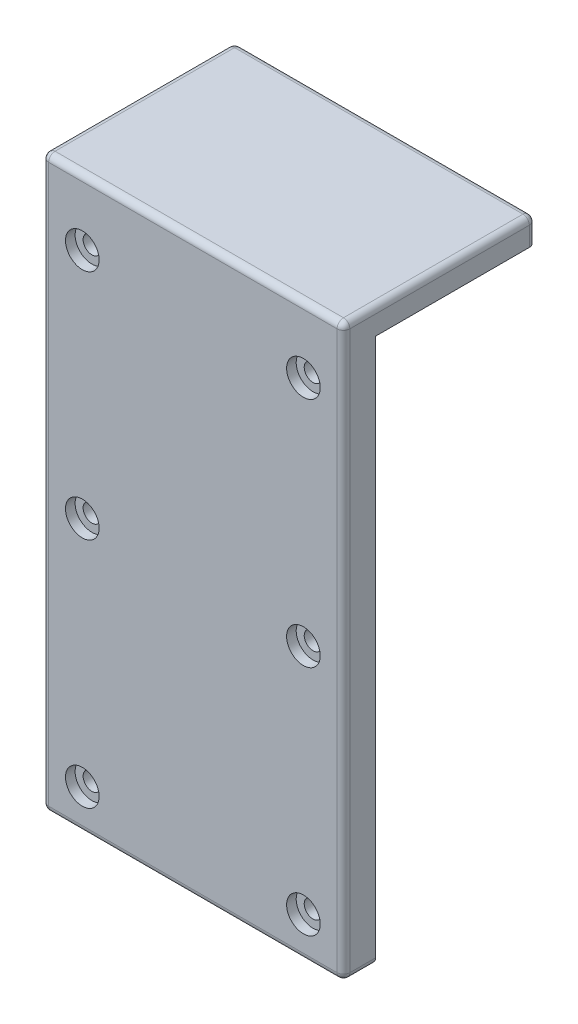
ISO-10303-21;
HEADER;
FILE_DESCRIPTION(('STEP AP214'),'2;1');
FILE_NAME('part.step','',(''),(''),'','','');
FILE_SCHEMA(('AUTOMOTIVE_DESIGN { 1 0 10303 214 1 1 1 1 }'));
ENDSEC;
DATA;
#1=APPLICATION_CONTEXT('core data for automotive mechanical design processes');
#2=APPLICATION_PROTOCOL_DEFINITION('international standard','automotive_design',2000,#1);
#3=PRODUCT_CONTEXT('',#1,'mechanical');
#4=PRODUCT('Part','Part','',(#3));
#5=PRODUCT_RELATED_PRODUCT_CATEGORY('part','',(#4));
#6=PRODUCT_DEFINITION_FORMATION('','',#4);
#7=PRODUCT_DEFINITION_CONTEXT('part definition',#1,'design');
#8=PRODUCT_DEFINITION('design','',#6,#7);
#9=PRODUCT_DEFINITION_SHAPE('','',#8);
#10=(LENGTH_UNIT() NAMED_UNIT(*) SI_UNIT(.MILLI.,.METRE.));
#11=(NAMED_UNIT(*) PLANE_ANGLE_UNIT() SI_UNIT($,.RADIAN.));
#12=(NAMED_UNIT(*) SI_UNIT($,.STERADIAN.) SOLID_ANGLE_UNIT());
#13=UNCERTAINTY_MEASURE_WITH_UNIT(LENGTH_MEASURE(1.E-05),#10,'distance_accuracy_value','');
#14=(GEOMETRIC_REPRESENTATION_CONTEXT(3) GLOBAL_UNCERTAINTY_ASSIGNED_CONTEXT((#13)) GLOBAL_UNIT_ASSIGNED_CONTEXT((#10,
#11,#12)) REPRESENTATION_CONTEXT('',''));
#15=CARTESIAN_POINT('',(0.,0.,0.));
#16=DIRECTION('',(0.,0.,1.));
#17=DIRECTION('',(1.,0.,0.));
#18=AXIS2_PLACEMENT_3D('',#15,#16,#17);
#19=CARTESIAN_POINT('',(0.,0.,10.));
#20=DIRECTION('',(1.,0.,0.));
#21=DIRECTION('',(0.,0.,-1.));
#22=AXIS2_PLACEMENT_3D('',#19,#20,#21);
#23=PLANE('',#22);
#24=DIRECTION('',(0.,0.,1.));
#25=VECTOR('',#24,1.);
#26=CARTESIAN_POINT('',(0.,176.,10.));
#27=LINE('',#26,#25);
#28=CARTESIAN_POINT('',(0.,176.,8.));
#29=VERTEX_POINT('',#28);
#30=CARTESIAN_POINT('',(0.,176.,-48.));
#31=VERTEX_POINT('',#30);
#32=EDGE_CURVE('E175',#29,#31,#27,.F.);
#33=ORIENTED_EDGE('',*,*,#32,.T.);
#34=DIRECTION('',(0.,-1.,0.));
#35=VECTOR('',#34,1.);
#36=CARTESIAN_POINT('',(0.,0.,-48.));
#37=LINE('',#36,#35);
#38=CARTESIAN_POINT('',(0.,170.,-48.));
#39=VERTEX_POINT('',#38);
#40=EDGE_CURVE('E156',#31,#39,#37,.T.);
#41=ORIENTED_EDGE('',*,*,#40,.T.);
#42=DIRECTION('',(0.,0.,1.));
#43=VECTOR('',#42,1.);
#44=CARTESIAN_POINT('',(0.,170.,10.));
#45=LINE('',#44,#43);
#46=CARTESIAN_POINT('',(0.,170.,0.));
#47=VERTEX_POINT('',#46);
#48=EDGE_CURVE('E151',#39,#47,#45,.T.);
#49=ORIENTED_EDGE('',*,*,#48,.T.);
#50=DIRECTION('',(0.,-1.,0.));
#51=VECTOR('',#50,1.);
#52=CARTESIAN_POINT('',(0.,0.,0.));
#53=LINE('',#52,#51);
#54=CARTESIAN_POINT('',(0.,2.,0.));
#55=VERTEX_POINT('',#54);
#56=EDGE_CURVE('E153',#47,#55,#53,.T.);
#57=ORIENTED_EDGE('',*,*,#56,.T.);
#58=DIRECTION('',(0.,0.,-1.));
#59=VECTOR('',#58,1.);
#60=CARTESIAN_POINT('',(0.,2.,10.));
#61=LINE('',#60,#59);
#62=CARTESIAN_POINT('',(0.,2.,8.));
#63=VERTEX_POINT('',#62);
#64=EDGE_CURVE('E184',#55,#63,#61,.F.);
#65=ORIENTED_EDGE('',*,*,#64,.T.);
#66=DIRECTION('',(0.,-1.,0.));
#67=VECTOR('',#66,1.);
#68=CARTESIAN_POINT('',(0.,0.,8.));
#69=LINE('',#68,#67);
#70=EDGE_CURVE('E178',#63,#29,#69,.F.);
#71=ORIENTED_EDGE('',*,*,#70,.T.);
#72=EDGE_LOOP('',(#33,#41,#49,#57,#65,#71));
#73=FACE_BOUND('',#72,.T.);
#74=ADVANCED_FACE('F47',(#73),#23,.F.);
#75=CARTESIAN_POINT('',(0.,0.,10.));
#76=DIRECTION('',(0.,1.,0.));
#77=DIRECTION('',(0.,0.,1.));
#78=AXIS2_PLACEMENT_3D('',#75,#76,#77);
#79=PLANE('',#78);
#80=DIRECTION('',(1.,0.,0.));
#81=VECTOR('',#80,1.);
#82=CARTESIAN_POINT('',(0.,0.,0.));
#83=LINE('',#82,#81);
#84=CARTESIAN_POINT('',(2.,0.,0.));
#85=VERTEX_POINT('',#84);
#86=CARTESIAN_POINT('',(92.,0.,0.));
#87=VERTEX_POINT('',#86);
#88=EDGE_CURVE('E170',#85,#87,#83,.T.);
#89=ORIENTED_EDGE('',*,*,#88,.T.);
#90=DIRECTION('',(0.,0.,-1.));
#91=VECTOR('',#90,1.);
#92=CARTESIAN_POINT('',(92.,0.,10.));
#93=LINE('',#92,#91);
#94=CARTESIAN_POINT('',(92.,0.,8.));
#95=VERTEX_POINT('',#94);
#96=EDGE_CURVE('E221',#87,#95,#93,.F.);
#97=ORIENTED_EDGE('',*,*,#96,.T.);
#98=DIRECTION('',(1.,0.,0.));
#99=VECTOR('',#98,1.);
#100=CARTESIAN_POINT('',(0.,0.,8.));
#101=LINE('',#100,#99);
#102=CARTESIAN_POINT('',(2.,0.,8.));
#103=VERTEX_POINT('',#102);
#104=EDGE_CURVE('E217',#95,#103,#101,.F.);
#105=ORIENTED_EDGE('',*,*,#104,.T.);
#106=DIRECTION('',(0.,0.,-1.));
#107=VECTOR('',#106,1.);
#108=CARTESIAN_POINT('',(2.,0.,10.));
#109=LINE('',#108,#107);
#110=EDGE_CURVE('E219',#103,#85,#109,.T.);
#111=ORIENTED_EDGE('',*,*,#110,.T.);
#112=EDGE_LOOP('',(#89,#97,#105,#111));
#113=FACE_BOUND('',#112,.T.);
#114=ADVANCED_FACE('F290',(#113),#79,.F.);
#115=CARTESIAN_POINT('',(94.,0.,10.));
#116=DIRECTION('',(-1.,0.,0.));
#117=DIRECTION('',(0.,0.,1.));
#118=AXIS2_PLACEMENT_3D('',#115,#116,#117);
#119=PLANE('',#118);
#120=DIRECTION('',(0.,0.,-1.));
#121=VECTOR('',#120,1.);
#122=CARTESIAN_POINT('',(94.,170.,10.));
#123=LINE('',#122,#121);
#124=CARTESIAN_POINT('',(94.,170.,0.));
#125=VERTEX_POINT('',#124);
#126=CARTESIAN_POINT('',(94.,170.,-48.));
#127=VERTEX_POINT('',#126);
#128=EDGE_CURVE('E159',#125,#127,#123,.T.);
#129=ORIENTED_EDGE('',*,*,#128,.T.);
#130=DIRECTION('',(0.,-1.,0.));
#131=VECTOR('',#130,1.);
#132=CARTESIAN_POINT('',(94.,0.,-48.));
#133=LINE('',#132,#131);
#134=CARTESIAN_POINT('',(94.,176.,-48.));
#135=VERTEX_POINT('',#134);
#136=EDGE_CURVE('E203',#127,#135,#133,.F.);
#137=ORIENTED_EDGE('',*,*,#136,.T.);
#138=DIRECTION('',(0.,0.,-1.));
#139=VECTOR('',#138,1.);
#140=CARTESIAN_POINT('',(94.,176.,10.));
#141=LINE('',#140,#139);
#142=CARTESIAN_POINT('',(94.,176.,8.));
#143=VERTEX_POINT('',#142);
#144=EDGE_CURVE('E199',#135,#143,#141,.F.);
#145=ORIENTED_EDGE('',*,*,#144,.T.);
#146=DIRECTION('',(0.,1.,0.));
#147=VECTOR('',#146,1.);
#148=CARTESIAN_POINT('',(94.,0.,8.));
#149=LINE('',#148,#147);
#150=CARTESIAN_POINT('',(94.,2.,8.));
#151=VERTEX_POINT('',#150);
#152=EDGE_CURVE('E197',#143,#151,#149,.F.);
#153=ORIENTED_EDGE('',*,*,#152,.T.);
#154=DIRECTION('',(0.,0.,-1.));
#155=VECTOR('',#154,1.);
#156=CARTESIAN_POINT('',(94.,2.,10.));
#157=LINE('',#156,#155);
#158=CARTESIAN_POINT('',(94.,2.,0.));
#159=VERTEX_POINT('',#158);
#160=EDGE_CURVE('E201',#151,#159,#157,.T.);
#161=ORIENTED_EDGE('',*,*,#160,.T.);
#162=DIRECTION('',(0.,1.,0.));
#163=VECTOR('',#162,1.);
#164=CARTESIAN_POINT('',(94.,0.,0.));
#165=LINE('',#164,#163);
#166=EDGE_CURVE('E176',#159,#125,#165,.T.);
#167=ORIENTED_EDGE('',*,*,#166,.T.);
#168=EDGE_LOOP('',(#129,#137,#145,#153,#161,#167));
#169=FACE_BOUND('',#168,.T.);
#170=ADVANCED_FACE('F287',(#169),#119,.F.);
#171=CARTESIAN_POINT('',(0.,0.,10.));
#172=DIRECTION('',(0.,0.,-1.));
#173=DIRECTION('',(-1.,0.,0.));
#174=AXIS2_PLACEMENT_3D('',#171,#172,#173);
#175=PLANE('',#174);
#176=DIRECTION('',(0.,-1.,0.));
#177=VECTOR('',#176,1.);
#178=CARTESIAN_POINT('',(2.,0.,10.));
#179=LINE('',#178,#177);
#180=CARTESIAN_POINT('',(2.,176.,10.));
#181=VERTEX_POINT('',#180);
#182=CARTESIAN_POINT('',(2.,2.,10.));
#183=VERTEX_POINT('',#182);
#184=EDGE_CURVE('E56',#181,#183,#179,.T.);
#185=ORIENTED_EDGE('',*,*,#184,.T.);
#186=DIRECTION('',(1.,0.,0.));
#187=VECTOR('',#186,1.);
#188=CARTESIAN_POINT('',(0.,2.,10.));
#189=LINE('',#188,#187);
#190=CARTESIAN_POINT('',(92.,2.,10.));
#191=VERTEX_POINT('',#190);
#192=EDGE_CURVE('E11',#183,#191,#189,.T.);
#193=ORIENTED_EDGE('',*,*,#192,.T.);
#194=DIRECTION('',(0.,1.,0.));
#195=VECTOR('',#194,1.);
#196=CARTESIAN_POINT('',(92.,0.,10.));
#197=LINE('',#196,#195);
#198=CARTESIAN_POINT('',(92.,176.,10.));
#199=VERTEX_POINT('',#198);
#200=EDGE_CURVE('E70',#191,#199,#197,.T.);
#201=ORIENTED_EDGE('',*,*,#200,.T.);
#202=DIRECTION('',(1.,0.,0.));
#203=VECTOR('',#202,1.);
#204=CARTESIAN_POINT('',(0.,176.,10.));
#205=LINE('',#204,#203);
#206=EDGE_CURVE('E223',#199,#181,#205,.F.);
#207=ORIENTED_EDGE('',*,*,#206,.T.);
#208=EDGE_LOOP('',(#185,#193,#201,#207));
#209=FACE_BOUND('',#208,.T.);
#210=CARTESIAN_POINT('',(12.5,85.,10.));
#211=DIRECTION('',(0.,0.,1.));
#212=DIRECTION('',(1.,0.,0.));
#213=AXIS2_PLACEMENT_3D('',#210,#211,#212);
#214=CIRCLE('',#213,5.25);
#215=CARTESIAN_POINT('',(17.75,85.,10.));
#216=VERTEX_POINT('',#215);
#217=EDGE_CURVE('E361',#216,#216,#214,.T.);
#218=ORIENTED_EDGE('',*,*,#217,.F.);
#219=EDGE_LOOP('',(#218));
#220=FACE_BOUND('',#219,.T.);
#221=CARTESIAN_POINT('',(12.5,157.5,10.));
#222=DIRECTION('',(0.,0.,1.));
#223=DIRECTION('',(1.,0.,0.));
#224=AXIS2_PLACEMENT_3D('',#221,#222,#223);
#225=CIRCLE('',#224,5.25);
#226=CARTESIAN_POINT('',(17.75,157.5,10.));
#227=VERTEX_POINT('',#226);
#228=EDGE_CURVE('E349',#227,#227,#225,.T.);
#229=ORIENTED_EDGE('',*,*,#228,.F.);
#230=EDGE_LOOP('',(#229));
#231=FACE_BOUND('',#230,.T.);
#232=CARTESIAN_POINT('',(81.5,85.,10.));
#233=DIRECTION('',(0.,0.,1.));
#234=DIRECTION('',(1.,0.,0.));
#235=AXIS2_PLACEMENT_3D('',#232,#233,#234);
#236=CIRCLE('',#235,5.25);
#237=CARTESIAN_POINT('',(86.75,85.,10.));
#238=VERTEX_POINT('',#237);
#239=EDGE_CURVE('E337',#238,#238,#236,.T.);
#240=ORIENTED_EDGE('',*,*,#239,.F.);
#241=EDGE_LOOP('',(#240));
#242=FACE_BOUND('',#241,.T.);
#243=CARTESIAN_POINT('',(12.5,12.5,10.));
#244=DIRECTION('',(0.,0.,1.));
#245=DIRECTION('',(1.,0.,0.));
#246=AXIS2_PLACEMENT_3D('',#243,#244,#245);
#247=CIRCLE('',#246,5.25);
#248=CARTESIAN_POINT('',(17.75,12.5,10.));
#249=VERTEX_POINT('',#248);
#250=EDGE_CURVE('E325',#249,#249,#247,.T.);
#251=ORIENTED_EDGE('',*,*,#250,.F.);
#252=EDGE_LOOP('',(#251));
#253=FACE_BOUND('',#252,.T.);
#254=CARTESIAN_POINT('',(81.5,12.5,10.));
#255=DIRECTION('',(0.,0.,1.));
#256=DIRECTION('',(1.,0.,0.));
#257=AXIS2_PLACEMENT_3D('',#254,#255,#256);
#258=CIRCLE('',#257,5.25);
#259=CARTESIAN_POINT('',(86.75,12.5,10.));
#260=VERTEX_POINT('',#259);
#261=EDGE_CURVE('E313',#260,#260,#258,.T.);
#262=ORIENTED_EDGE('',*,*,#261,.F.);
#263=EDGE_LOOP('',(#262));
#264=FACE_BOUND('',#263,.T.);
#265=CARTESIAN_POINT('',(81.5,157.5,10.));
#266=DIRECTION('',(0.,0.,1.));
#267=DIRECTION('',(1.,0.,0.));
#268=AXIS2_PLACEMENT_3D('',#265,#266,#267);
#269=CIRCLE('',#268,5.25);
#270=CARTESIAN_POINT('',(86.75,157.5,10.));
#271=VERTEX_POINT('',#270);
#272=EDGE_CURVE('E301',#271,#271,#269,.T.);
#273=ORIENTED_EDGE('',*,*,#272,.F.);
#274=EDGE_LOOP('',(#273));
#275=FACE_BOUND('',#274,.T.);
#276=ADVANCED_FACE('F385',(#209,#220,#231,#242,#253,#264,#275),#175,.F.);
#277=CARTESIAN_POINT('',(0.,0.,0.));
#278=DIRECTION('',(0.,0.,-1.));
#279=DIRECTION('',(-1.,0.,0.));
#280=AXIS2_PLACEMENT_3D('',#277,#278,#279);
#281=PLANE('',#280);
#282=CARTESIAN_POINT('',(47.,140.,0.));
#283=DIRECTION('',(0.,0.,-1.));
#284=DIRECTION('',(-1.,0.,0.));
#285=AXIS2_PLACEMENT_3D('',#282,#283,#284);
#286=CIRCLE('',#285,1.65);
#287=CARTESIAN_POINT('',(45.35,140.,0.));
#288=VERTEX_POINT('',#287);
#289=EDGE_CURVE('E376',#288,#288,#286,.T.);
#290=ORIENTED_EDGE('',*,*,#289,.F.);
#291=EDGE_LOOP('',(#290));
#292=FACE_BOUND('',#291,.T.);
#293=CARTESIAN_POINT('',(47.,49.,0.));
#294=DIRECTION('',(0.,0.,-1.));
#295=DIRECTION('',(-1.,0.,0.));
#296=AXIS2_PLACEMENT_3D('',#293,#294,#295);
#297=CIRCLE('',#296,1.65);
#298=CARTESIAN_POINT('',(45.35,49.,0.));
#299=VERTEX_POINT('',#298);
#300=EDGE_CURVE('E370',#299,#299,#297,.T.);
#301=ORIENTED_EDGE('',*,*,#300,.F.);
#302=EDGE_LOOP('',(#301));
#303=FACE_BOUND('',#302,.T.);
#304=CARTESIAN_POINT('',(12.5,85.,0.));
#305=DIRECTION('',(0.,0.,1.));
#306=DIRECTION('',(1.,0.,0.));
#307=AXIS2_PLACEMENT_3D('',#304,#305,#306);
#308=CIRCLE('',#307,2.75);
#309=CARTESIAN_POINT('',(15.25,85.,0.));
#310=VERTEX_POINT('',#309);
#311=EDGE_CURVE('E352',#310,#310,#308,.T.);
#312=ORIENTED_EDGE('',*,*,#311,.T.);
#313=EDGE_LOOP('',(#312));
#314=FACE_BOUND('',#313,.T.);
#315=CARTESIAN_POINT('',(12.5,157.5,0.));
#316=DIRECTION('',(0.,0.,1.));
#317=DIRECTION('',(1.,0.,0.));
#318=AXIS2_PLACEMENT_3D('',#315,#316,#317);
#319=CIRCLE('',#318,2.75);
#320=CARTESIAN_POINT('',(15.25,157.5,0.));
#321=VERTEX_POINT('',#320);
#322=EDGE_CURVE('E340',#321,#321,#319,.T.);
#323=ORIENTED_EDGE('',*,*,#322,.T.);
#324=EDGE_LOOP('',(#323));
#325=FACE_BOUND('',#324,.T.);
#326=CARTESIAN_POINT('',(81.5,85.,0.));
#327=DIRECTION('',(0.,0.,1.));
#328=DIRECTION('',(1.,0.,0.));
#329=AXIS2_PLACEMENT_3D('',#326,#327,#328);
#330=CIRCLE('',#329,2.75);
#331=CARTESIAN_POINT('',(84.25,85.,0.));
#332=VERTEX_POINT('',#331);
#333=EDGE_CURVE('E328',#332,#332,#330,.T.);
#334=ORIENTED_EDGE('',*,*,#333,.T.);
#335=EDGE_LOOP('',(#334));
#336=FACE_BOUND('',#335,.T.);
#337=CARTESIAN_POINT('',(12.5,12.5,0.));
#338=DIRECTION('',(0.,0.,1.));
#339=DIRECTION('',(1.,0.,0.));
#340=AXIS2_PLACEMENT_3D('',#337,#338,#339);
#341=CIRCLE('',#340,2.75);
#342=CARTESIAN_POINT('',(15.25,12.5,0.));
#343=VERTEX_POINT('',#342);
#344=EDGE_CURVE('E316',#343,#343,#341,.T.);
#345=ORIENTED_EDGE('',*,*,#344,.T.);
#346=EDGE_LOOP('',(#345));
#347=FACE_BOUND('',#346,.T.);
#348=CARTESIAN_POINT('',(81.5,12.5,0.));
#349=DIRECTION('',(0.,0.,1.));
#350=DIRECTION('',(1.,0.,0.));
#351=AXIS2_PLACEMENT_3D('',#348,#349,#350);
#352=CIRCLE('',#351,2.75);
#353=CARTESIAN_POINT('',(84.25,12.5,0.));
#354=VERTEX_POINT('',#353);
#355=EDGE_CURVE('E304',#354,#354,#352,.T.);
#356=ORIENTED_EDGE('',*,*,#355,.T.);
#357=EDGE_LOOP('',(#356));
#358=FACE_BOUND('',#357,.T.);
#359=CARTESIAN_POINT('',(81.5,157.5,0.));
#360=DIRECTION('',(0.,0.,1.));
#361=DIRECTION('',(1.,0.,0.));
#362=AXIS2_PLACEMENT_3D('',#359,#360,#361);
#363=CIRCLE('',#362,2.75);
#364=CARTESIAN_POINT('',(84.25,157.5,0.));
#365=VERTEX_POINT('',#364);
#366=EDGE_CURVE('E171',#365,#365,#363,.T.);
#367=ORIENTED_EDGE('',*,*,#366,.T.);
#368=EDGE_LOOP('',(#367));
#369=FACE_BOUND('',#368,.T.);
#370=ORIENTED_EDGE('',*,*,#166,.F.);
#371=CARTESIAN_POINT('',(92.,2.,0.));
#372=DIRECTION('',(0.,0.,-1.));
#373=DIRECTION('',(-1.,0.,0.));
#374=AXIS2_PLACEMENT_3D('',#371,#372,#373);
#375=CIRCLE('',#374,2.);
#376=EDGE_CURVE('E215',#159,#87,#375,.T.);
#377=ORIENTED_EDGE('',*,*,#376,.T.);
#378=ORIENTED_EDGE('',*,*,#88,.F.);
#379=CARTESIAN_POINT('',(2.,2.,0.));
#380=DIRECTION('',(0.,0.,-1.));
#381=DIRECTION('',(-1.,0.,0.));
#382=AXIS2_PLACEMENT_3D('',#379,#380,#381);
#383=CIRCLE('',#382,2.);
#384=EDGE_CURVE('E169',#85,#55,#383,.T.);
#385=ORIENTED_EDGE('',*,*,#384,.T.);
#386=ORIENTED_EDGE('',*,*,#56,.F.);
#387=DIRECTION('',(-1.,0.,0.));
#388=VECTOR('',#387,1.);
#389=CARTESIAN_POINT('',(0.,170.,0.));
#390=LINE('',#389,#388);
#391=EDGE_CURVE('E165',#125,#47,#390,.T.);
#392=ORIENTED_EDGE('',*,*,#391,.F.);
#393=EDGE_LOOP('',(#370,#377,#378,#385,#386,#392));
#394=FACE_BOUND('',#393,.T.);
#395=ADVANCED_FACE('F164',(#292,#303,#314,#325,#336,#347,#358,#369,#394),#281,.T.);
#396=CARTESIAN_POINT('',(81.5,157.5,10.));
#397=DIRECTION('',(0.,0.,1.));
#398=DIRECTION('',(1.,0.,0.));
#399=AXIS2_PLACEMENT_3D('',#396,#397,#398);
#400=CYLINDRICAL_SURFACE('',#399,2.75);
#401=ORIENTED_EDGE('',*,*,#366,.F.);
#402=EDGE_LOOP('',(#401));
#403=FACE_BOUND('',#402,.T.);
#404=CARTESIAN_POINT('',(81.5,157.5,7.));
#405=DIRECTION('',(0.,0.,1.));
#406=DIRECTION('',(1.,0.,0.));
#407=AXIS2_PLACEMENT_3D('',#404,#405,#406);
#408=CIRCLE('',#407,2.75);
#409=CARTESIAN_POINT('',(84.25,157.5,7.));
#410=VERTEX_POINT('',#409);
#411=EDGE_CURVE('E295',#410,#410,#408,.T.);
#412=ORIENTED_EDGE('',*,*,#411,.T.);
#413=EDGE_LOOP('',(#412));
#414=FACE_BOUND('',#413,.T.);
#415=ADVANCED_FACE('F384',(#403,#414),#400,.F.);
#416=CARTESIAN_POINT('',(84.25,157.5,7.));
#417=DIRECTION('',(0.,0.,-1.));
#418=DIRECTION('',(-1.,0.,0.));
#419=AXIS2_PLACEMENT_3D('',#416,#417,#418);
#420=PLANE('',#419);
#421=ORIENTED_EDGE('',*,*,#411,.F.);
#422=EDGE_LOOP('',(#421));
#423=FACE_BOUND('',#422,.T.);
#424=CARTESIAN_POINT('',(81.5,157.5,7.));
#425=DIRECTION('',(0.,0.,1.));
#426=DIRECTION('',(1.,0.,0.));
#427=AXIS2_PLACEMENT_3D('',#424,#425,#426);
#428=CIRCLE('',#427,5.25);
#429=CARTESIAN_POINT('',(86.75,157.5,7.));
#430=VERTEX_POINT('',#429);
#431=EDGE_CURVE('E298',#430,#430,#428,.T.);
#432=ORIENTED_EDGE('',*,*,#431,.T.);
#433=EDGE_LOOP('',(#432));
#434=FACE_BOUND('',#433,.T.);
#435=ADVANCED_FACE('F403',(#423,#434),#420,.F.);
#436=CARTESIAN_POINT('',(81.5,157.5,10.));
#437=DIRECTION('',(0.,0.,1.));
#438=DIRECTION('',(1.,0.,0.));
#439=AXIS2_PLACEMENT_3D('',#436,#437,#438);
#440=CYLINDRICAL_SURFACE('',#439,5.25);
#441=ORIENTED_EDGE('',*,*,#431,.F.);
#442=EDGE_LOOP('',(#441));
#443=FACE_BOUND('',#442,.T.);
#444=ORIENTED_EDGE('',*,*,#272,.T.);
#445=EDGE_LOOP('',(#444));
#446=FACE_BOUND('',#445,.T.);
#447=ADVANCED_FACE('F409',(#443,#446),#440,.F.);
#448=CARTESIAN_POINT('',(81.5,12.5,10.));
#449=DIRECTION('',(0.,0.,1.));
#450=DIRECTION('',(1.,0.,0.));
#451=AXIS2_PLACEMENT_3D('',#448,#449,#450);
#452=CYLINDRICAL_SURFACE('',#451,2.75);
#453=ORIENTED_EDGE('',*,*,#355,.F.);
#454=EDGE_LOOP('',(#453));
#455=FACE_BOUND('',#454,.T.);
#456=CARTESIAN_POINT('',(81.5,12.5,7.));
#457=DIRECTION('',(0.,0.,1.));
#458=DIRECTION('',(1.,0.,0.));
#459=AXIS2_PLACEMENT_3D('',#456,#457,#458);
#460=CIRCLE('',#459,2.75);
#461=CARTESIAN_POINT('',(84.25,12.5,7.));
#462=VERTEX_POINT('',#461);
#463=EDGE_CURVE('E307',#462,#462,#460,.T.);
#464=ORIENTED_EDGE('',*,*,#463,.T.);
#465=EDGE_LOOP('',(#464));
#466=FACE_BOUND('',#465,.T.);
#467=ADVANCED_FACE('F415',(#455,#466),#452,.F.);
#468=CARTESIAN_POINT('',(84.25,12.5,7.));
#469=DIRECTION('',(0.,0.,-1.));
#470=DIRECTION('',(-1.,0.,0.));
#471=AXIS2_PLACEMENT_3D('',#468,#469,#470);
#472=PLANE('',#471);
#473=ORIENTED_EDGE('',*,*,#463,.F.);
#474=EDGE_LOOP('',(#473));
#475=FACE_BOUND('',#474,.T.);
#476=CARTESIAN_POINT('',(81.5,12.5,7.));
#477=DIRECTION('',(0.,0.,1.));
#478=DIRECTION('',(1.,0.,0.));
#479=AXIS2_PLACEMENT_3D('',#476,#477,#478);
#480=CIRCLE('',#479,5.25);
#481=CARTESIAN_POINT('',(86.75,12.5,7.));
#482=VERTEX_POINT('',#481);
#483=EDGE_CURVE('E310',#482,#482,#480,.T.);
#484=ORIENTED_EDGE('',*,*,#483,.T.);
#485=EDGE_LOOP('',(#484));
#486=FACE_BOUND('',#485,.T.);
#487=ADVANCED_FACE('F563',(#475,#486),#472,.F.);
#488=CARTESIAN_POINT('',(81.5,12.5,10.));
#489=DIRECTION('',(0.,0.,1.));
#490=DIRECTION('',(1.,0.,0.));
#491=AXIS2_PLACEMENT_3D('',#488,#489,#490);
#492=CYLINDRICAL_SURFACE('',#491,5.25);
#493=ORIENTED_EDGE('',*,*,#483,.F.);
#494=EDGE_LOOP('',(#493));
#495=FACE_BOUND('',#494,.T.);
#496=ORIENTED_EDGE('',*,*,#261,.T.);
#497=EDGE_LOOP('',(#496));
#498=FACE_BOUND('',#497,.T.);
#499=ADVANCED_FACE('F559',(#495,#498),#492,.F.);
#500=CARTESIAN_POINT('',(12.5,12.5,10.));
#501=DIRECTION('',(0.,0.,1.));
#502=DIRECTION('',(1.,0.,0.));
#503=AXIS2_PLACEMENT_3D('',#500,#501,#502);
#504=CYLINDRICAL_SURFACE('',#503,2.75);
#505=ORIENTED_EDGE('',*,*,#344,.F.);
#506=EDGE_LOOP('',(#505));
#507=FACE_BOUND('',#506,.T.);
#508=CARTESIAN_POINT('',(12.5,12.5,7.));
#509=DIRECTION('',(0.,0.,1.));
#510=DIRECTION('',(1.,0.,0.));
#511=AXIS2_PLACEMENT_3D('',#508,#509,#510);
#512=CIRCLE('',#511,2.75);
#513=CARTESIAN_POINT('',(15.25,12.5,7.));
#514=VERTEX_POINT('',#513);
#515=EDGE_CURVE('E319',#514,#514,#512,.T.);
#516=ORIENTED_EDGE('',*,*,#515,.T.);
#517=EDGE_LOOP('',(#516));
#518=FACE_BOUND('',#517,.T.);
#519=ADVANCED_FACE('F555',(#507,#518),#504,.F.);
#520=CARTESIAN_POINT('',(15.25,12.5,7.));
#521=DIRECTION('',(0.,0.,-1.));
#522=DIRECTION('',(-1.,0.,0.));
#523=AXIS2_PLACEMENT_3D('',#520,#521,#522);
#524=PLANE('',#523);
#525=ORIENTED_EDGE('',*,*,#515,.F.);
#526=EDGE_LOOP('',(#525));
#527=FACE_BOUND('',#526,.T.);
#528=CARTESIAN_POINT('',(12.5,12.5,7.));
#529=DIRECTION('',(0.,0.,1.));
#530=DIRECTION('',(1.,0.,0.));
#531=AXIS2_PLACEMENT_3D('',#528,#529,#530);
#532=CIRCLE('',#531,5.25);
#533=CARTESIAN_POINT('',(17.75,12.5,7.));
#534=VERTEX_POINT('',#533);
#535=EDGE_CURVE('E322',#534,#534,#532,.T.);
#536=ORIENTED_EDGE('',*,*,#535,.T.);
#537=EDGE_LOOP('',(#536));
#538=FACE_BOUND('',#537,.T.);
#539=ADVANCED_FACE('F551',(#527,#538),#524,.F.);
#540=CARTESIAN_POINT('',(12.5,12.5,10.));
#541=DIRECTION('',(0.,0.,1.));
#542=DIRECTION('',(1.,0.,0.));
#543=AXIS2_PLACEMENT_3D('',#540,#541,#542);
#544=CYLINDRICAL_SURFACE('',#543,5.25);
#545=ORIENTED_EDGE('',*,*,#535,.F.);
#546=EDGE_LOOP('',(#545));
#547=FACE_BOUND('',#546,.T.);
#548=ORIENTED_EDGE('',*,*,#250,.T.);
#549=EDGE_LOOP('',(#548));
#550=FACE_BOUND('',#549,.T.);
#551=ADVANCED_FACE('F547',(#547,#550),#544,.F.);
#552=CARTESIAN_POINT('',(81.5,85.,10.));
#553=DIRECTION('',(0.,0.,1.));
#554=DIRECTION('',(1.,0.,0.));
#555=AXIS2_PLACEMENT_3D('',#552,#553,#554);
#556=CYLINDRICAL_SURFACE('',#555,2.75);
#557=ORIENTED_EDGE('',*,*,#333,.F.);
#558=EDGE_LOOP('',(#557));
#559=FACE_BOUND('',#558,.T.);
#560=CARTESIAN_POINT('',(81.5,85.,7.));
#561=DIRECTION('',(0.,0.,1.));
#562=DIRECTION('',(1.,0.,0.));
#563=AXIS2_PLACEMENT_3D('',#560,#561,#562);
#564=CIRCLE('',#563,2.75);
#565=CARTESIAN_POINT('',(84.25,85.,7.));
#566=VERTEX_POINT('',#565);
#567=EDGE_CURVE('E331',#566,#566,#564,.T.);
#568=ORIENTED_EDGE('',*,*,#567,.T.);
#569=EDGE_LOOP('',(#568));
#570=FACE_BOUND('',#569,.T.);
#571=ADVANCED_FACE('F543',(#559,#570),#556,.F.);
#572=CARTESIAN_POINT('',(84.25,85.,7.));
#573=DIRECTION('',(0.,0.,-1.));
#574=DIRECTION('',(-1.,0.,0.));
#575=AXIS2_PLACEMENT_3D('',#572,#573,#574);
#576=PLANE('',#575);
#577=ORIENTED_EDGE('',*,*,#567,.F.);
#578=EDGE_LOOP('',(#577));
#579=FACE_BOUND('',#578,.T.);
#580=CARTESIAN_POINT('',(81.5,85.,7.));
#581=DIRECTION('',(0.,0.,1.));
#582=DIRECTION('',(1.,0.,0.));
#583=AXIS2_PLACEMENT_3D('',#580,#581,#582);
#584=CIRCLE('',#583,5.25);
#585=CARTESIAN_POINT('',(86.75,85.,7.));
#586=VERTEX_POINT('',#585);
#587=EDGE_CURVE('E334',#586,#586,#584,.T.);
#588=ORIENTED_EDGE('',*,*,#587,.T.);
#589=EDGE_LOOP('',(#588));
#590=FACE_BOUND('',#589,.T.);
#591=ADVANCED_FACE('F539',(#579,#590),#576,.F.);
#592=CARTESIAN_POINT('',(81.5,85.,10.));
#593=DIRECTION('',(0.,0.,1.));
#594=DIRECTION('',(1.,0.,0.));
#595=AXIS2_PLACEMENT_3D('',#592,#593,#594);
#596=CYLINDRICAL_SURFACE('',#595,5.25);
#597=ORIENTED_EDGE('',*,*,#587,.F.);
#598=EDGE_LOOP('',(#597));
#599=FACE_BOUND('',#598,.T.);
#600=ORIENTED_EDGE('',*,*,#239,.T.);
#601=EDGE_LOOP('',(#600));
#602=FACE_BOUND('',#601,.T.);
#603=ADVANCED_FACE('F535',(#599,#602),#596,.F.);
#604=CARTESIAN_POINT('',(12.5,157.5,10.));
#605=DIRECTION('',(0.,0.,1.));
#606=DIRECTION('',(1.,0.,0.));
#607=AXIS2_PLACEMENT_3D('',#604,#605,#606);
#608=CYLINDRICAL_SURFACE('',#607,2.75);
#609=ORIENTED_EDGE('',*,*,#322,.F.);
#610=EDGE_LOOP('',(#609));
#611=FACE_BOUND('',#610,.T.);
#612=CARTESIAN_POINT('',(12.5,157.5,7.));
#613=DIRECTION('',(0.,0.,1.));
#614=DIRECTION('',(1.,0.,0.));
#615=AXIS2_PLACEMENT_3D('',#612,#613,#614);
#616=CIRCLE('',#615,2.75);
#617=CARTESIAN_POINT('',(15.25,157.5,7.));
#618=VERTEX_POINT('',#617);
#619=EDGE_CURVE('E343',#618,#618,#616,.T.);
#620=ORIENTED_EDGE('',*,*,#619,.T.);
#621=EDGE_LOOP('',(#620));
#622=FACE_BOUND('',#621,.T.);
#623=ADVANCED_FACE('F531',(#611,#622),#608,.F.);
#624=CARTESIAN_POINT('',(15.25,157.5,7.));
#625=DIRECTION('',(0.,0.,-1.));
#626=DIRECTION('',(-1.,0.,0.));
#627=AXIS2_PLACEMENT_3D('',#624,#625,#626);
#628=PLANE('',#627);
#629=ORIENTED_EDGE('',*,*,#619,.F.);
#630=EDGE_LOOP('',(#629));
#631=FACE_BOUND('',#630,.T.);
#632=CARTESIAN_POINT('',(12.5,157.5,7.));
#633=DIRECTION('',(0.,0.,1.));
#634=DIRECTION('',(1.,0.,0.));
#635=AXIS2_PLACEMENT_3D('',#632,#633,#634);
#636=CIRCLE('',#635,5.25);
#637=CARTESIAN_POINT('',(17.75,157.5,7.));
#638=VERTEX_POINT('',#637);
#639=EDGE_CURVE('E346',#638,#638,#636,.T.);
#640=ORIENTED_EDGE('',*,*,#639,.T.);
#641=EDGE_LOOP('',(#640));
#642=FACE_BOUND('',#641,.T.);
#643=ADVANCED_FACE('F527',(#631,#642),#628,.F.);
#644=CARTESIAN_POINT('',(12.5,157.5,10.));
#645=DIRECTION('',(0.,0.,1.));
#646=DIRECTION('',(1.,0.,0.));
#647=AXIS2_PLACEMENT_3D('',#644,#645,#646);
#648=CYLINDRICAL_SURFACE('',#647,5.25);
#649=ORIENTED_EDGE('',*,*,#639,.F.);
#650=EDGE_LOOP('',(#649));
#651=FACE_BOUND('',#650,.T.);
#652=ORIENTED_EDGE('',*,*,#228,.T.);
#653=EDGE_LOOP('',(#652));
#654=FACE_BOUND('',#653,.T.);
#655=ADVANCED_FACE('F523',(#651,#654),#648,.F.);
#656=CARTESIAN_POINT('',(12.5,85.,10.));
#657=DIRECTION('',(0.,0.,1.));
#658=DIRECTION('',(1.,0.,0.));
#659=AXIS2_PLACEMENT_3D('',#656,#657,#658);
#660=CYLINDRICAL_SURFACE('',#659,2.75);
#661=ORIENTED_EDGE('',*,*,#311,.F.);
#662=EDGE_LOOP('',(#661));
#663=FACE_BOUND('',#662,.T.);
#664=CARTESIAN_POINT('',(12.5,85.,7.));
#665=DIRECTION('',(0.,0.,1.));
#666=DIRECTION('',(1.,0.,0.));
#667=AXIS2_PLACEMENT_3D('',#664,#665,#666);
#668=CIRCLE('',#667,2.75);
#669=CARTESIAN_POINT('',(15.25,85.,7.));
#670=VERTEX_POINT('',#669);
#671=EDGE_CURVE('E355',#670,#670,#668,.T.);
#672=ORIENTED_EDGE('',*,*,#671,.T.);
#673=EDGE_LOOP('',(#672));
#674=FACE_BOUND('',#673,.T.);
#675=ADVANCED_FACE('F519',(#663,#674),#660,.F.);
#676=CARTESIAN_POINT('',(15.25,85.,7.));
#677=DIRECTION('',(0.,0.,-1.));
#678=DIRECTION('',(-1.,0.,0.));
#679=AXIS2_PLACEMENT_3D('',#676,#677,#678);
#680=PLANE('',#679);
#681=ORIENTED_EDGE('',*,*,#671,.F.);
#682=EDGE_LOOP('',(#681));
#683=FACE_BOUND('',#682,.T.);
#684=CARTESIAN_POINT('',(12.5,85.,7.));
#685=DIRECTION('',(0.,0.,1.));
#686=DIRECTION('',(1.,0.,0.));
#687=AXIS2_PLACEMENT_3D('',#684,#685,#686);
#688=CIRCLE('',#687,5.25);
#689=CARTESIAN_POINT('',(17.75,85.,7.));
#690=VERTEX_POINT('',#689);
#691=EDGE_CURVE('E358',#690,#690,#688,.T.);
#692=ORIENTED_EDGE('',*,*,#691,.T.);
#693=EDGE_LOOP('',(#692));
#694=FACE_BOUND('',#693,.T.);
#695=ADVANCED_FACE('F515',(#683,#694),#680,.F.);
#696=CARTESIAN_POINT('',(12.5,85.,10.));
#697=DIRECTION('',(0.,0.,1.));
#698=DIRECTION('',(1.,0.,0.));
#699=AXIS2_PLACEMENT_3D('',#696,#697,#698);
#700=CYLINDRICAL_SURFACE('',#699,5.25);
#701=ORIENTED_EDGE('',*,*,#691,.F.);
#702=EDGE_LOOP('',(#701));
#703=FACE_BOUND('',#702,.T.);
#704=ORIENTED_EDGE('',*,*,#217,.T.);
#705=EDGE_LOOP('',(#704));
#706=FACE_BOUND('',#705,.T.);
#707=ADVANCED_FACE('F512',(#703,#706),#700,.F.);
#708=CARTESIAN_POINT('',(0.,178.,-50.));
#709=DIRECTION('',(0.,0.,1.));
#710=DIRECTION('',(1.,0.,0.));
#711=AXIS2_PLACEMENT_3D('',#708,#709,#710);
#712=PLANE('',#711);
#713=DIRECTION('',(-1.,0.,0.));
#714=VECTOR('',#713,1.);
#715=CARTESIAN_POINT('',(0.,170.,-50.));
#716=LINE('',#715,#714);
#717=CARTESIAN_POINT('',(92.,170.,-50.));
#718=VERTEX_POINT('',#717);
#719=CARTESIAN_POINT('',(2.,170.,-50.));
#720=VERTEX_POINT('',#719);
#721=EDGE_CURVE('E364',#718,#720,#716,.T.);
#722=ORIENTED_EDGE('',*,*,#721,.T.);
#723=DIRECTION('',(0.,-1.,0.));
#724=VECTOR('',#723,1.);
#725=CARTESIAN_POINT('',(2.,178.,-50.));
#726=LINE('',#725,#724);
#727=CARTESIAN_POINT('',(2.,176.,-50.));
#728=VERTEX_POINT('',#727);
#729=EDGE_CURVE('E195',#720,#728,#726,.F.);
#730=ORIENTED_EDGE('',*,*,#729,.T.);
#731=DIRECTION('',(-1.,0.,0.));
#732=VECTOR('',#731,1.);
#733=CARTESIAN_POINT('',(0.,176.,-50.));
#734=LINE('',#733,#732);
#735=CARTESIAN_POINT('',(92.,176.,-50.));
#736=VERTEX_POINT('',#735);
#737=EDGE_CURVE('E191',#728,#736,#734,.F.);
#738=ORIENTED_EDGE('',*,*,#737,.T.);
#739=DIRECTION('',(0.,-1.,0.));
#740=VECTOR('',#739,1.);
#741=CARTESIAN_POINT('',(92.,178.,-50.));
#742=LINE('',#741,#740);
#743=EDGE_CURVE('E193',#736,#718,#742,.T.);
#744=ORIENTED_EDGE('',*,*,#743,.T.);
#745=EDGE_LOOP('',(#722,#730,#738,#744));
#746=FACE_BOUND('',#745,.T.);
#747=ADVANCED_FACE('F506',(#746),#712,.F.);
#748=CARTESIAN_POINT('',(0.,178.,0.));
#749=DIRECTION('',(0.,-1.,0.));
#750=DIRECTION('',(0.,0.,-1.));
#751=AXIS2_PLACEMENT_3D('',#748,#749,#750);
#752=PLANE('',#751);
#753=DIRECTION('',(0.,0.,-1.));
#754=VECTOR('',#753,1.);
#755=CARTESIAN_POINT('',(92.,178.,0.));
#756=LINE('',#755,#754);
#757=CARTESIAN_POINT('',(92.,178.,8.));
#758=VERTEX_POINT('',#757);
#759=CARTESIAN_POINT('',(92.,178.,-48.));
#760=VERTEX_POINT('',#759);
#761=EDGE_CURVE('E207',#758,#760,#756,.T.);
#762=ORIENTED_EDGE('',*,*,#761,.T.);
#763=DIRECTION('',(-1.,0.,0.));
#764=VECTOR('',#763,1.);
#765=CARTESIAN_POINT('',(0.,178.,-48.));
#766=LINE('',#765,#764);
#767=CARTESIAN_POINT('',(2.,178.,-48.));
#768=VERTEX_POINT('',#767);
#769=EDGE_CURVE('E211',#760,#768,#766,.T.);
#770=ORIENTED_EDGE('',*,*,#769,.T.);
#771=DIRECTION('',(0.,0.,1.));
#772=VECTOR('',#771,1.);
#773=CARTESIAN_POINT('',(2.,178.,0.));
#774=LINE('',#773,#772);
#775=CARTESIAN_POINT('',(2.,178.,8.));
#776=VERTEX_POINT('',#775);
#777=EDGE_CURVE('E209',#768,#776,#774,.T.);
#778=ORIENTED_EDGE('',*,*,#777,.T.);
#779=DIRECTION('',(1.,0.,0.));
#780=VECTOR('',#779,1.);
#781=CARTESIAN_POINT('',(0.,178.,8.));
#782=LINE('',#781,#780);
#783=EDGE_CURVE('E205',#776,#758,#782,.T.);
#784=ORIENTED_EDGE('',*,*,#783,.T.);
#785=EDGE_LOOP('',(#762,#770,#778,#784));
#786=FACE_BOUND('',#785,.T.);
#787=ADVANCED_FACE('F501',(#786),#752,.F.);
#788=CARTESIAN_POINT('',(0.,170.,0.));
#789=DIRECTION('',(0.,-1.,0.));
#790=DIRECTION('',(0.,0.,-1.));
#791=AXIS2_PLACEMENT_3D('',#788,#789,#790);
#792=PLANE('',#791);
#793=ORIENTED_EDGE('',*,*,#48,.F.);
#794=CARTESIAN_POINT('',(2.,170.,-48.));
#795=DIRECTION('',(0.,-1.,0.));
#796=DIRECTION('',(0.,0.,-1.));
#797=AXIS2_PLACEMENT_3D('',#794,#795,#796);
#798=CIRCLE('',#797,2.);
#799=EDGE_CURVE('E189',#39,#720,#798,.T.);
#800=ORIENTED_EDGE('',*,*,#799,.T.);
#801=ORIENTED_EDGE('',*,*,#721,.F.);
#802=CARTESIAN_POINT('',(92.,170.,-48.));
#803=DIRECTION('',(0.,-1.,0.));
#804=DIRECTION('',(0.,0.,-1.));
#805=AXIS2_PLACEMENT_3D('',#802,#803,#804);
#806=CIRCLE('',#805,2.);
#807=EDGE_CURVE('E187',#718,#127,#806,.T.);
#808=ORIENTED_EDGE('',*,*,#807,.T.);
#809=ORIENTED_EDGE('',*,*,#128,.F.);
#810=ORIENTED_EDGE('',*,*,#391,.T.);
#811=EDGE_LOOP('',(#793,#800,#801,#808,#809,#810));
#812=FACE_BOUND('',#811,.T.);
#813=ADVANCED_FACE('F173',(#812),#792,.T.);
#814=CARTESIAN_POINT('',(92.,2.,10.));
#815=DIRECTION('',(0.,0.,-1.));
#816=DIRECTION('',(-1.,0.,0.));
#817=AXIS2_PLACEMENT_3D('',#814,#815,#816);
#818=CYLINDRICAL_SURFACE('',#817,2.);
#819=CARTESIAN_POINT('',(92.,2.,8.));
#820=DIRECTION('',(0.,0.,1.));
#821=DIRECTION('',(1.,0.,0.));
#822=AXIS2_PLACEMENT_3D('',#819,#820,#821);
#823=CIRCLE('',#822,2.);
#824=EDGE_CURVE('E51',#95,#151,#823,.T.);
#825=ORIENTED_EDGE('',*,*,#824,.F.);
#826=ORIENTED_EDGE('',*,*,#96,.F.);
#827=ORIENTED_EDGE('',*,*,#376,.F.);
#828=ORIENTED_EDGE('',*,*,#160,.F.);
#829=EDGE_LOOP('',(#825,#826,#827,#828));
#830=FACE_BOUND('',#829,.T.);
#831=ADVANCED_FACE('F49',(#830),#818,.T.);
#832=CARTESIAN_POINT('',(92.,2.,8.));
#833=DIRECTION('',(1.,0.,0.));
#834=DIRECTION('',(0.,0.,-1.));
#835=AXIS2_PLACEMENT_3D('',#832,#833,#834);
#836=SPHERICAL_SURFACE('',#835,2.);
#837=CARTESIAN_POINT('',(92.,2.,8.));
#838=DIRECTION('',(1.,0.,0.));
#839=DIRECTION('',(0.,0.,-1.));
#840=AXIS2_PLACEMENT_3D('',#837,#838,#839);
#841=CIRCLE('',#840,2.);
#842=EDGE_CURVE('E272',#95,#191,#841,.F.);
#843=ORIENTED_EDGE('',*,*,#842,.F.);
#844=ORIENTED_EDGE('',*,*,#824,.T.);
#845=CARTESIAN_POINT('',(92.,2.,8.));
#846=DIRECTION('',(0.,-1.,0.));
#847=DIRECTION('',(0.,0.,-1.));
#848=AXIS2_PLACEMENT_3D('',#845,#846,#847);
#849=CIRCLE('',#848,2.);
#850=EDGE_CURVE('E274',#191,#151,#849,.F.);
#851=ORIENTED_EDGE('',*,*,#850,.F.);
#852=EDGE_LOOP('',(#843,#844,#851));
#853=FACE_BOUND('',#852,.T.);
#854=ADVANCED_FACE('F280',(#853),#836,.T.);
#855=CARTESIAN_POINT('',(92.,0.,8.));
#856=DIRECTION('',(0.,1.,0.));
#857=DIRECTION('',(0.,0.,1.));
#858=AXIS2_PLACEMENT_3D('',#855,#856,#857);
#859=CYLINDRICAL_SURFACE('',#858,2.);
#860=ORIENTED_EDGE('',*,*,#850,.T.);
#861=ORIENTED_EDGE('',*,*,#152,.F.);
#862=CARTESIAN_POINT('',(92.,176.,8.));
#863=DIRECTION('',(0.,1.,0.));
#864=DIRECTION('',(0.,0.,1.));
#865=AXIS2_PLACEMENT_3D('',#862,#863,#864);
#866=CIRCLE('',#865,2.);
#867=EDGE_CURVE('E269',#199,#143,#866,.T.);
#868=ORIENTED_EDGE('',*,*,#867,.F.);
#869=ORIENTED_EDGE('',*,*,#200,.F.);
#870=EDGE_LOOP('',(#860,#861,#868,#869));
#871=FACE_BOUND('',#870,.T.);
#872=ADVANCED_FACE('F491',(#871),#859,.T.);
#873=CARTESIAN_POINT('',(0.,2.,8.));
#874=DIRECTION('',(1.,0.,0.));
#875=DIRECTION('',(0.,0.,-1.));
#876=AXIS2_PLACEMENT_3D('',#873,#874,#875);
#877=CYLINDRICAL_SURFACE('',#876,2.);
#878=ORIENTED_EDGE('',*,*,#842,.T.);
#879=ORIENTED_EDGE('',*,*,#192,.F.);
#880=CARTESIAN_POINT('',(2.,2.,8.));
#881=DIRECTION('',(-1.,0.,0.));
#882=DIRECTION('',(0.,0.,1.));
#883=AXIS2_PLACEMENT_3D('',#880,#881,#882);
#884=CIRCLE('',#883,2.);
#885=EDGE_CURVE('E266',#103,#183,#884,.T.);
#886=ORIENTED_EDGE('',*,*,#885,.F.);
#887=ORIENTED_EDGE('',*,*,#104,.F.);
#888=EDGE_LOOP('',(#878,#879,#886,#887));
#889=FACE_BOUND('',#888,.T.);
#890=ADVANCED_FACE('F487',(#889),#877,.T.);
#891=CARTESIAN_POINT('',(2.,2.,10.));
#892=DIRECTION('',(0.,0.,-1.));
#893=DIRECTION('',(-1.,0.,0.));
#894=AXIS2_PLACEMENT_3D('',#891,#892,#893);
#895=CYLINDRICAL_SURFACE('',#894,2.);
#896=ORIENTED_EDGE('',*,*,#384,.F.);
#897=ORIENTED_EDGE('',*,*,#110,.F.);
#898=CARTESIAN_POINT('',(2.,2.,8.));
#899=DIRECTION('',(0.,0.,1.));
#900=DIRECTION('',(1.,0.,0.));
#901=AXIS2_PLACEMENT_3D('',#898,#899,#900);
#902=CIRCLE('',#901,2.);
#903=EDGE_CURVE('E263',#63,#103,#902,.T.);
#904=ORIENTED_EDGE('',*,*,#903,.F.);
#905=ORIENTED_EDGE('',*,*,#64,.F.);
#906=EDGE_LOOP('',(#896,#897,#904,#905));
#907=FACE_BOUND('',#906,.T.);
#908=ADVANCED_FACE('F483',(#907),#895,.T.);
#909=CARTESIAN_POINT('',(92.,176.,8.));
#910=DIRECTION('',(1.,0.,0.));
#911=DIRECTION('',(0.,0.,-1.));
#912=AXIS2_PLACEMENT_3D('',#909,#910,#911);
#913=SPHERICAL_SURFACE('',#912,2.);
#914=CARTESIAN_POINT('',(92.,176.,8.));
#915=DIRECTION('',(1.,0.,0.));
#916=DIRECTION('',(0.,0.,-1.));
#917=AXIS2_PLACEMENT_3D('',#914,#915,#916);
#918=CIRCLE('',#917,2.);
#919=EDGE_CURVE('E257',#199,#758,#918,.F.);
#920=ORIENTED_EDGE('',*,*,#919,.F.);
#921=ORIENTED_EDGE('',*,*,#867,.T.);
#922=CARTESIAN_POINT('',(92.,176.,8.));
#923=DIRECTION('',(0.,0.,1.));
#924=DIRECTION('',(1.,0.,0.));
#925=AXIS2_PLACEMENT_3D('',#922,#923,#924);
#926=CIRCLE('',#925,2.);
#927=EDGE_CURVE('E260',#758,#143,#926,.F.);
#928=ORIENTED_EDGE('',*,*,#927,.F.);
#929=EDGE_LOOP('',(#920,#921,#928));
#930=FACE_BOUND('',#929,.T.);
#931=ADVANCED_FACE('F479',(#930),#913,.T.);
#932=CARTESIAN_POINT('',(2.,2.,8.));
#933=DIRECTION('',(0.,-1.,0.));
#934=DIRECTION('',(0.,0.,-1.));
#935=AXIS2_PLACEMENT_3D('',#932,#933,#934);
#936=SPHERICAL_SURFACE('',#935,2.);
#937=ORIENTED_EDGE('',*,*,#903,.T.);
#938=ORIENTED_EDGE('',*,*,#885,.T.);
#939=CARTESIAN_POINT('',(2.,2.,8.));
#940=DIRECTION('',(0.,-1.,0.));
#941=DIRECTION('',(0.,0.,-1.));
#942=AXIS2_PLACEMENT_3D('',#939,#940,#941);
#943=CIRCLE('',#942,2.);
#944=EDGE_CURVE('E254',#63,#183,#943,.F.);
#945=ORIENTED_EDGE('',*,*,#944,.F.);
#946=EDGE_LOOP('',(#937,#938,#945));
#947=FACE_BOUND('',#946,.T.);
#948=ADVANCED_FACE('F475',(#947),#936,.T.);
#949=CARTESIAN_POINT('',(92.,178.,-48.));
#950=DIRECTION('',(0.,-1.,0.));
#951=DIRECTION('',(0.,0.,-1.));
#952=AXIS2_PLACEMENT_3D('',#949,#950,#951);
#953=CYLINDRICAL_SURFACE('',#952,2.);
#954=ORIENTED_EDGE('',*,*,#807,.F.);
#955=ORIENTED_EDGE('',*,*,#743,.F.);
#956=CARTESIAN_POINT('',(92.,176.,-48.));
#957=DIRECTION('',(0.,1.,0.));
#958=DIRECTION('',(0.,0.,1.));
#959=AXIS2_PLACEMENT_3D('',#956,#957,#958);
#960=CIRCLE('',#959,2.);
#961=EDGE_CURVE('E251',#135,#736,#960,.T.);
#962=ORIENTED_EDGE('',*,*,#961,.F.);
#963=ORIENTED_EDGE('',*,*,#136,.F.);
#964=EDGE_LOOP('',(#954,#955,#962,#963));
#965=FACE_BOUND('',#964,.T.);
#966=ADVANCED_FACE('F471',(#965),#953,.T.);
#967=CARTESIAN_POINT('',(92.,176.,0.));
#968=DIRECTION('',(0.,0.,-1.));
#969=DIRECTION('',(-1.,0.,0.));
#970=AXIS2_PLACEMENT_3D('',#967,#968,#969);
#971=CYLINDRICAL_SURFACE('',#970,2.);
#972=ORIENTED_EDGE('',*,*,#927,.T.);
#973=ORIENTED_EDGE('',*,*,#144,.F.);
#974=CARTESIAN_POINT('',(92.,176.,-48.));
#975=DIRECTION('',(0.,0.,-1.));
#976=DIRECTION('',(-1.,0.,0.));
#977=AXIS2_PLACEMENT_3D('',#974,#975,#976);
#978=CIRCLE('',#977,2.);
#979=EDGE_CURVE('E248',#760,#135,#978,.T.);
#980=ORIENTED_EDGE('',*,*,#979,.F.);
#981=ORIENTED_EDGE('',*,*,#761,.F.);
#982=EDGE_LOOP('',(#972,#973,#980,#981));
#983=FACE_BOUND('',#982,.T.);
#984=ADVANCED_FACE('F467',(#983),#971,.T.);
#985=CARTESIAN_POINT('',(0.,176.,8.));
#986=DIRECTION('',(1.,0.,0.));
#987=DIRECTION('',(0.,0.,-1.));
#988=AXIS2_PLACEMENT_3D('',#985,#986,#987);
#989=CYLINDRICAL_SURFACE('',#988,2.);
#990=ORIENTED_EDGE('',*,*,#919,.T.);
#991=ORIENTED_EDGE('',*,*,#783,.F.);
#992=CARTESIAN_POINT('',(2.,176.,8.));
#993=DIRECTION('',(-1.,0.,0.));
#994=DIRECTION('',(0.,0.,1.));
#995=AXIS2_PLACEMENT_3D('',#992,#993,#994);
#996=CIRCLE('',#995,2.);
#997=EDGE_CURVE('E245',#181,#776,#996,.T.);
#998=ORIENTED_EDGE('',*,*,#997,.F.);
#999=ORIENTED_EDGE('',*,*,#206,.F.);
#1000=EDGE_LOOP('',(#990,#991,#998,#999));
#1001=FACE_BOUND('',#1000,.T.);
#1002=ADVANCED_FACE('F463',(#1001),#989,.T.);
#1003=CARTESIAN_POINT('',(2.,0.,8.));
#1004=DIRECTION('',(0.,-1.,0.));
#1005=DIRECTION('',(0.,0.,-1.));
#1006=AXIS2_PLACEMENT_3D('',#1003,#1004,#1005);
#1007=CYLINDRICAL_SURFACE('',#1006,2.);
#1008=ORIENTED_EDGE('',*,*,#944,.T.);
#1009=ORIENTED_EDGE('',*,*,#184,.F.);
#1010=CARTESIAN_POINT('',(2.,176.,8.));
#1011=DIRECTION('',(0.,1.,0.));
#1012=DIRECTION('',(0.,0.,1.));
#1013=AXIS2_PLACEMENT_3D('',#1010,#1011,#1012);
#1014=CIRCLE('',#1013,2.);
#1015=EDGE_CURVE('E242',#29,#181,#1014,.T.);
#1016=ORIENTED_EDGE('',*,*,#1015,.F.);
#1017=ORIENTED_EDGE('',*,*,#70,.F.);
#1018=EDGE_LOOP('',(#1008,#1009,#1016,#1017));
#1019=FACE_BOUND('',#1018,.T.);
#1020=ADVANCED_FACE('F459',(#1019),#1007,.T.);
#1021=CARTESIAN_POINT('',(92.,176.,-48.));
#1022=DIRECTION('',(1.,0.,0.));
#1023=DIRECTION('',(0.,0.,-1.));
#1024=AXIS2_PLACEMENT_3D('',#1021,#1022,#1023);
#1025=SPHERICAL_SURFACE('',#1024,2.);
#1026=ORIENTED_EDGE('',*,*,#979,.T.);
#1027=ORIENTED_EDGE('',*,*,#961,.T.);
#1028=CARTESIAN_POINT('',(92.,176.,-48.));
#1029=DIRECTION('',(1.,0.,0.));
#1030=DIRECTION('',(0.,0.,-1.));
#1031=AXIS2_PLACEMENT_3D('',#1028,#1029,#1030);
#1032=CIRCLE('',#1031,2.);
#1033=EDGE_CURVE('E239',#760,#736,#1032,.F.);
#1034=ORIENTED_EDGE('',*,*,#1033,.F.);
#1035=EDGE_LOOP('',(#1026,#1027,#1034));
#1036=FACE_BOUND('',#1035,.T.);
#1037=ADVANCED_FACE('F455',(#1036),#1025,.T.);
#1038=CARTESIAN_POINT('',(2.,176.,8.));
#1039=DIRECTION('',(0.,0.,1.));
#1040=DIRECTION('',(1.,0.,0.));
#1041=AXIS2_PLACEMENT_3D('',#1038,#1039,#1040);
#1042=SPHERICAL_SURFACE('',#1041,2.);
#1043=ORIENTED_EDGE('',*,*,#1015,.T.);
#1044=ORIENTED_EDGE('',*,*,#997,.T.);
#1045=CARTESIAN_POINT('',(2.,176.,8.));
#1046=DIRECTION('',(0.,0.,1.));
#1047=DIRECTION('',(1.,0.,0.));
#1048=AXIS2_PLACEMENT_3D('',#1045,#1046,#1047);
#1049=CIRCLE('',#1048,2.);
#1050=EDGE_CURVE('E236',#29,#776,#1049,.F.);
#1051=ORIENTED_EDGE('',*,*,#1050,.F.);
#1052=EDGE_LOOP('',(#1043,#1044,#1051));
#1053=FACE_BOUND('',#1052,.T.);
#1054=ADVANCED_FACE('F451',(#1053),#1042,.T.);
#1055=CARTESIAN_POINT('',(0.,176.,-48.));
#1056=DIRECTION('',(-1.,0.,0.));
#1057=DIRECTION('',(0.,0.,1.));
#1058=AXIS2_PLACEMENT_3D('',#1055,#1056,#1057);
#1059=CYLINDRICAL_SURFACE('',#1058,2.);
#1060=ORIENTED_EDGE('',*,*,#1033,.T.);
#1061=ORIENTED_EDGE('',*,*,#737,.F.);
#1062=CARTESIAN_POINT('',(2.,176.,-48.));
#1063=DIRECTION('',(-1.,0.,0.));
#1064=DIRECTION('',(0.,0.,1.));
#1065=AXIS2_PLACEMENT_3D('',#1062,#1063,#1064);
#1066=CIRCLE('',#1065,2.);
#1067=EDGE_CURVE('E233',#768,#728,#1066,.T.);
#1068=ORIENTED_EDGE('',*,*,#1067,.F.);
#1069=ORIENTED_EDGE('',*,*,#769,.F.);
#1070=EDGE_LOOP('',(#1060,#1061,#1068,#1069));
#1071=FACE_BOUND('',#1070,.T.);
#1072=ADVANCED_FACE('F447',(#1071),#1059,.T.);
#1073=CARTESIAN_POINT('',(2.,176.,0.));
#1074=DIRECTION('',(0.,0.,1.));
#1075=DIRECTION('',(1.,0.,0.));
#1076=AXIS2_PLACEMENT_3D('',#1073,#1074,#1075);
#1077=CYLINDRICAL_SURFACE('',#1076,2.);
#1078=ORIENTED_EDGE('',*,*,#1050,.T.);
#1079=ORIENTED_EDGE('',*,*,#777,.F.);
#1080=CARTESIAN_POINT('',(2.,176.,-48.));
#1081=DIRECTION('',(0.,0.,-1.));
#1082=DIRECTION('',(-1.,0.,0.));
#1083=AXIS2_PLACEMENT_3D('',#1080,#1081,#1082);
#1084=CIRCLE('',#1083,2.);
#1085=EDGE_CURVE('E230',#31,#768,#1084,.T.);
#1086=ORIENTED_EDGE('',*,*,#1085,.F.);
#1087=ORIENTED_EDGE('',*,*,#32,.F.);
#1088=EDGE_LOOP('',(#1078,#1079,#1086,#1087));
#1089=FACE_BOUND('',#1088,.T.);
#1090=ADVANCED_FACE('F443',(#1089),#1077,.T.);
#1091=CARTESIAN_POINT('',(2.,176.,-48.));
#1092=DIRECTION('',(0.,1.,0.));
#1093=DIRECTION('',(0.,0.,1.));
#1094=AXIS2_PLACEMENT_3D('',#1091,#1092,#1093);
#1095=SPHERICAL_SURFACE('',#1094,2.);
#1096=ORIENTED_EDGE('',*,*,#1085,.T.);
#1097=ORIENTED_EDGE('',*,*,#1067,.T.);
#1098=CARTESIAN_POINT('',(2.,176.,-48.));
#1099=DIRECTION('',(0.,1.,0.));
#1100=DIRECTION('',(0.,0.,1.));
#1101=AXIS2_PLACEMENT_3D('',#1098,#1099,#1100);
#1102=CIRCLE('',#1101,2.);
#1103=EDGE_CURVE('E227',#31,#728,#1102,.F.);
#1104=ORIENTED_EDGE('',*,*,#1103,.F.);
#1105=EDGE_LOOP('',(#1096,#1097,#1104));
#1106=FACE_BOUND('',#1105,.T.);
#1107=ADVANCED_FACE('F439',(#1106),#1095,.T.);
#1108=CARTESIAN_POINT('',(2.,0.,-48.));
#1109=DIRECTION('',(0.,-1.,0.));
#1110=DIRECTION('',(0.,0.,-1.));
#1111=AXIS2_PLACEMENT_3D('',#1108,#1109,#1110);
#1112=CYLINDRICAL_SURFACE('',#1111,2.);
#1113=ORIENTED_EDGE('',*,*,#1103,.T.);
#1114=ORIENTED_EDGE('',*,*,#729,.F.);
#1115=ORIENTED_EDGE('',*,*,#799,.F.);
#1116=ORIENTED_EDGE('',*,*,#40,.F.);
#1117=EDGE_LOOP('',(#1113,#1114,#1115,#1116));
#1118=FACE_BOUND('',#1117,.T.);
#1119=ADVANCED_FACE('F435',(#1118),#1112,.T.);
#1120=CARTESIAN_POINT('',(47.,49.,8.));
#1121=DIRECTION('',(0.,0.,1.));
#1122=DIRECTION('',(1.,0.,0.));
#1123=AXIS2_PLACEMENT_3D('',#1120,#1121,#1122);
#1124=PLANE('',#1123);
#1125=CARTESIAN_POINT('',(47.,49.,8.));
#1126=DIRECTION('',(0.,0.,-1.));
#1127=DIRECTION('',(-1.,0.,0.));
#1128=AXIS2_PLACEMENT_3D('',#1125,#1126,#1127);
#1129=CIRCLE('',#1128,1.65);
#1130=CARTESIAN_POINT('',(45.35,49.,8.));
#1131=VERTEX_POINT('',#1130);
#1132=EDGE_CURVE('E231',#1131,#1131,#1129,.T.);
#1133=ORIENTED_EDGE('',*,*,#1132,.T.);
#1134=EDGE_LOOP('',(#1133));
#1135=FACE_BOUND('',#1134,.T.);
#1136=ADVANCED_FACE('F438',(#1135),#1124,.F.);
#1137=CARTESIAN_POINT('',(47.,49.,0.));
#1138=DIRECTION('',(0.,0.,-1.));
#1139=DIRECTION('',(-1.,0.,0.));
#1140=AXIS2_PLACEMENT_3D('',#1137,#1138,#1139);
#1141=CYLINDRICAL_SURFACE('',#1140,1.65);
#1142=ORIENTED_EDGE('',*,*,#1132,.F.);
#1143=EDGE_LOOP('',(#1142));
#1144=FACE_BOUND('',#1143,.T.);
#1145=ORIENTED_EDGE('',*,*,#300,.T.);
#1146=EDGE_LOOP('',(#1145));
#1147=FACE_BOUND('',#1146,.T.);
#1148=ADVANCED_FACE('F798',(#1144,#1147),#1141,.F.);
#1149=CARTESIAN_POINT('',(47.,140.,8.));
#1150=DIRECTION('',(0.,0.,1.));
#1151=DIRECTION('',(1.,0.,0.));
#1152=AXIS2_PLACEMENT_3D('',#1149,#1150,#1151);
#1153=PLANE('',#1152);
#1154=CARTESIAN_POINT('',(47.,140.,8.));
#1155=DIRECTION('',(0.,0.,-1.));
#1156=DIRECTION('',(-1.,0.,0.));
#1157=AXIS2_PLACEMENT_3D('',#1154,#1155,#1156);
#1158=CIRCLE('',#1157,1.65);
#1159=CARTESIAN_POINT('',(45.35,140.,8.));
#1160=VERTEX_POINT('',#1159);
#1161=EDGE_CURVE('E373',#1160,#1160,#1158,.T.);
#1162=ORIENTED_EDGE('',*,*,#1161,.T.);
#1163=EDGE_LOOP('',(#1162));
#1164=FACE_BOUND('',#1163,.T.);
#1165=ADVANCED_FACE('F808',(#1164),#1153,.F.);
#1166=CARTESIAN_POINT('',(47.,140.,0.));
#1167=DIRECTION('',(0.,0.,-1.));
#1168=DIRECTION('',(-1.,0.,0.));
#1169=AXIS2_PLACEMENT_3D('',#1166,#1167,#1168);
#1170=CYLINDRICAL_SURFACE('',#1169,1.65);
#1171=ORIENTED_EDGE('',*,*,#1161,.F.);
#1172=EDGE_LOOP('',(#1171));
#1173=FACE_BOUND('',#1172,.T.);
#1174=ORIENTED_EDGE('',*,*,#289,.T.);
#1175=EDGE_LOOP('',(#1174));
#1176=FACE_BOUND('',#1175,.T.);
#1177=ADVANCED_FACE('F380',(#1173,#1176),#1170,.F.);
#1178=CLOSED_SHELL('',(#74,#114,#170,#276,#395,#415,#435,#447,#467,#487,#499,#519,#539,#551,
#571,#591,#603,#623,#643,#655,#675,#695,#707,#747,#787,#813,#831,#854,#872,#890,#908,#931,#948,
#966,#984,#1002,#1020,#1037,#1054,#1072,#1090,#1107,#1119,#1136,#1148,#1165,#1177));
#1179=MANIFOLD_SOLID_BREP('B2',#1178);
#1180=ADVANCED_BREP_SHAPE_REPRESENTATION('',(#18,#1179),#14);
#1181=SHAPE_DEFINITION_REPRESENTATION(#9,#1180);
ENDSEC;
END-ISO-10303-21;
